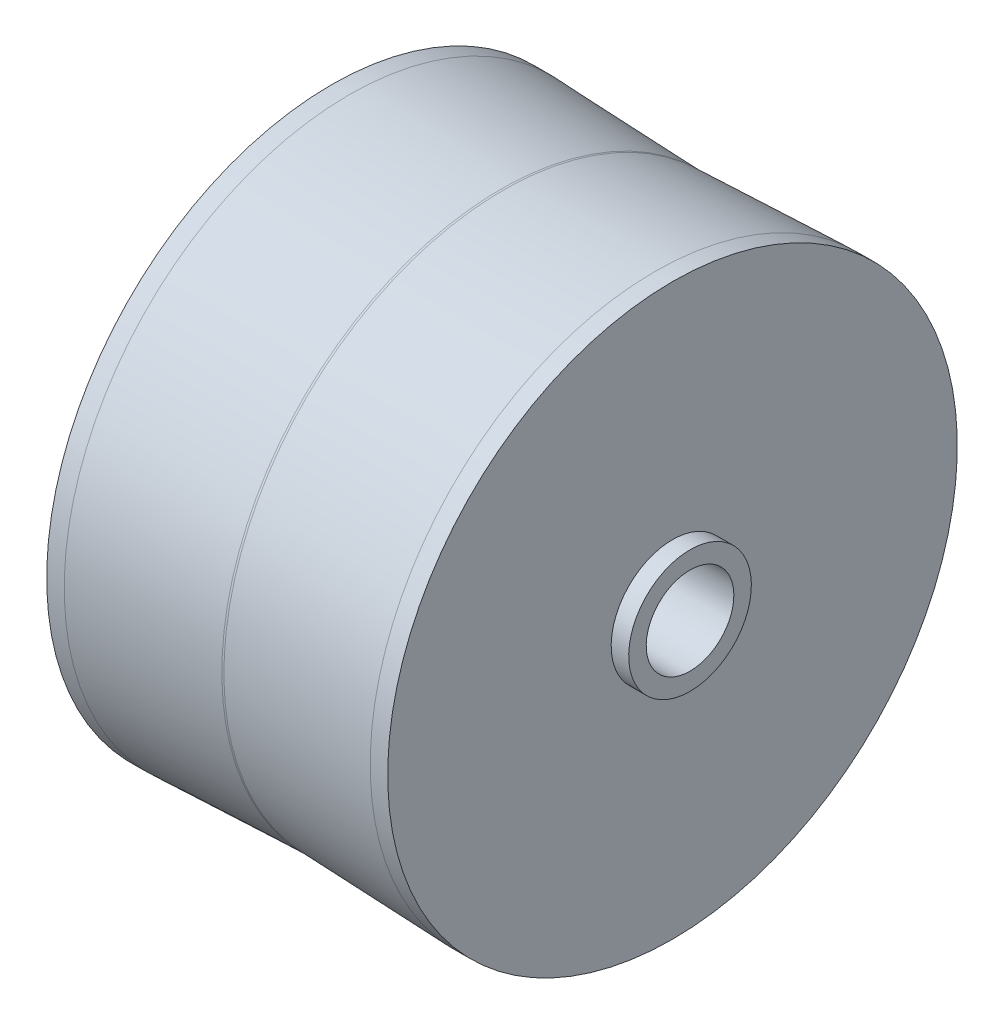
ISO-10303-21;
HEADER;
FILE_DESCRIPTION(('STEP AP214'),'2;1');
FILE_NAME('part.step','',(''),(''),'','','');
FILE_SCHEMA(('AUTOMOTIVE_DESIGN { 1 0 10303 214 1 1 1 1 }'));
ENDSEC;
DATA;
#1=APPLICATION_CONTEXT('core data for automotive mechanical design processes');
#2=APPLICATION_PROTOCOL_DEFINITION('international standard','automotive_design',2000,#1);
#3=PRODUCT_CONTEXT('',#1,'mechanical');
#4=PRODUCT('Part','Part','',(#3));
#5=PRODUCT_RELATED_PRODUCT_CATEGORY('part','',(#4));
#6=PRODUCT_DEFINITION_FORMATION('','',#4);
#7=PRODUCT_DEFINITION_CONTEXT('part definition',#1,'design');
#8=PRODUCT_DEFINITION('design','',#6,#7);
#9=PRODUCT_DEFINITION_SHAPE('','',#8);
#10=(LENGTH_UNIT() NAMED_UNIT(*) SI_UNIT(.MILLI.,.METRE.));
#11=(NAMED_UNIT(*) PLANE_ANGLE_UNIT() SI_UNIT($,.RADIAN.));
#12=(NAMED_UNIT(*) SI_UNIT($,.STERADIAN.) SOLID_ANGLE_UNIT());
#13=UNCERTAINTY_MEASURE_WITH_UNIT(LENGTH_MEASURE(1.E-05),#10,'distance_accuracy_value','');
#14=(GEOMETRIC_REPRESENTATION_CONTEXT(3) GLOBAL_UNCERTAINTY_ASSIGNED_CONTEXT((#13)) GLOBAL_UNIT_ASSIGNED_CONTEXT((#10,
#11,#12)) REPRESENTATION_CONTEXT('',''));
#15=CARTESIAN_POINT('',(0.,0.,0.));
#16=DIRECTION('',(0.,0.,1.));
#17=DIRECTION('',(1.,0.,0.));
#18=AXIS2_PLACEMENT_3D('',#15,#16,#17);
#19=CARTESIAN_POINT('',(-27.25,8.89000000000002,0.));
#20=DIRECTION('',(1.,0.,0.));
#21=DIRECTION('',(0.,1.,0.));
#22=AXIS2_PLACEMENT_3D('',#19,#20,#21);
#23=PLANE('',#22);
#24=CARTESIAN_POINT('',(-27.25,0.,0.));
#25=DIRECTION('',(-1.,0.,0.));
#26=DIRECTION('',(0.,-1.,0.));
#27=AXIS2_PLACEMENT_3D('',#24,#25,#26);
#28=CIRCLE('',#27,6.34999999999998);
#29=CARTESIAN_POINT('',(-27.25,-6.34999999999995,0.));
#30=VERTEX_POINT('',#29);
#31=EDGE_CURVE('E10',#30,#30,#28,.T.);
#32=ORIENTED_EDGE('',*,*,#31,.F.);
#33=EDGE_LOOP('',(#32));
#34=FACE_BOUND('',#33,.T.);
#35=CARTESIAN_POINT('',(-27.25,0.,0.));
#36=DIRECTION('',(-1.,0.,0.));
#37=DIRECTION('',(0.,-1.,0.));
#38=AXIS2_PLACEMENT_3D('',#35,#36,#37);
#39=CIRCLE('',#38,8.88999999999999);
#40=CARTESIAN_POINT('',(-27.25,-8.88999999999997,0.));
#41=VERTEX_POINT('',#40);
#42=EDGE_CURVE('E71',#41,#41,#39,.T.);
#43=ORIENTED_EDGE('',*,*,#42,.T.);
#44=EDGE_LOOP('',(#43));
#45=FACE_BOUND('',#44,.T.);
#46=ADVANCED_FACE('F31',(#34,#45),#23,.F.);
#47=CARTESIAN_POINT('',(-27.25,0.,0.));
#48=DIRECTION('',(-1.,0.,0.));
#49=DIRECTION('',(0.,-1.,0.));
#50=AXIS2_PLACEMENT_3D('',#47,#48,#49);
#51=CYLINDRICAL_SURFACE('',#50,6.34999999999998);
#52=CARTESIAN_POINT('',(27.25,0.,0.));
#53=DIRECTION('',(-1.,0.,0.));
#54=DIRECTION('',(0.,-1.,0.));
#55=AXIS2_PLACEMENT_3D('',#52,#53,#54);
#56=CIRCLE('',#55,6.34999999999998);
#57=CARTESIAN_POINT('',(27.25,-6.34999999999994,0.));
#58=VERTEX_POINT('',#57);
#59=EDGE_CURVE('E37',#58,#58,#56,.T.);
#60=ORIENTED_EDGE('',*,*,#59,.F.);
#61=EDGE_LOOP('',(#60));
#62=FACE_BOUND('',#61,.T.);
#63=ORIENTED_EDGE('',*,*,#31,.T.);
#64=EDGE_LOOP('',(#63));
#65=FACE_BOUND('',#64,.T.);
#66=ADVANCED_FACE('F132',(#62,#65),#51,.F.);
#67=CARTESIAN_POINT('',(27.25,6.35000000000001,0.));
#68=DIRECTION('',(-1.,0.,0.));
#69=DIRECTION('',(0.,-1.,0.));
#70=AXIS2_PLACEMENT_3D('',#67,#68,#69);
#71=PLANE('',#70);
#72=CARTESIAN_POINT('',(27.25,0.,0.));
#73=DIRECTION('',(-1.,0.,0.));
#74=DIRECTION('',(0.,-1.,0.));
#75=AXIS2_PLACEMENT_3D('',#72,#73,#74);
#76=CIRCLE('',#75,8.88999999999986);
#77=CARTESIAN_POINT('',(27.25,-8.88999999999983,0.));
#78=VERTEX_POINT('',#77);
#79=EDGE_CURVE('E41',#78,#78,#76,.T.);
#80=ORIENTED_EDGE('',*,*,#79,.F.);
#81=EDGE_LOOP('',(#80));
#82=FACE_BOUND('',#81,.T.);
#83=ORIENTED_EDGE('',*,*,#59,.T.);
#84=EDGE_LOOP('',(#83));
#85=FACE_BOUND('',#84,.T.);
#86=ADVANCED_FACE('F127',(#82,#85),#71,.F.);
#87=CARTESIAN_POINT('',(-27.25,0.,0.));
#88=DIRECTION('',(-1.,0.,0.));
#89=DIRECTION('',(0.,-1.,0.));
#90=AXIS2_PLACEMENT_3D('',#87,#88,#89);
#91=CYLINDRICAL_SURFACE('',#90,8.88999999999986);
#92=CARTESIAN_POINT('',(24.71,0.,0.));
#93=DIRECTION('',(-1.,0.,0.));
#94=DIRECTION('',(0.,-1.,0.));
#95=AXIS2_PLACEMENT_3D('',#92,#93,#94);
#96=CIRCLE('',#95,8.88999999999986);
#97=CARTESIAN_POINT('',(24.71,-8.88999999999983,0.));
#98=VERTEX_POINT('',#97);
#99=EDGE_CURVE('E45',#98,#98,#96,.T.);
#100=ORIENTED_EDGE('',*,*,#99,.F.);
#101=EDGE_LOOP('',(#100));
#102=FACE_BOUND('',#101,.T.);
#103=ORIENTED_EDGE('',*,*,#79,.T.);
#104=EDGE_LOOP('',(#103));
#105=FACE_BOUND('',#104,.T.);
#106=ADVANCED_FACE('F121',(#102,#105),#91,.T.);
#107=CARTESIAN_POINT('',(24.71,8.88999999999989,0.));
#108=DIRECTION('',(-1.,0.,0.));
#109=DIRECTION('',(0.,-1.,0.));
#110=AXIS2_PLACEMENT_3D('',#107,#108,#109);
#111=PLANE('',#110);
#112=CARTESIAN_POINT('',(24.71,0.,0.));
#113=DIRECTION('',(-1.,0.,0.));
#114=DIRECTION('',(0.,-1.,0.));
#115=AXIS2_PLACEMENT_3D('',#112,#113,#114);
#116=CIRCLE('',#115,41.275);
#117=CARTESIAN_POINT('',(24.71,-41.275,0.));
#118=VERTEX_POINT('',#117);
#119=EDGE_CURVE('E50',#118,#118,#116,.T.);
#120=ORIENTED_EDGE('',*,*,#119,.F.);
#121=EDGE_LOOP('',(#120));
#122=FACE_BOUND('',#121,.T.);
#123=ORIENTED_EDGE('',*,*,#99,.T.);
#124=EDGE_LOOP('',(#123));
#125=FACE_BOUND('',#124,.T.);
#126=ADVANCED_FACE('F115',(#122,#125),#111,.F.);
#127=CARTESIAN_POINT('',(-27.25,0.,0.));
#128=DIRECTION('',(-1.,0.,0.));
#129=DIRECTION('',(0.,-1.,0.));
#130=AXIS2_PLACEMENT_3D('',#127,#128,#129);
#131=CYLINDRICAL_SURFACE('',#130,41.275);
#132=CARTESIAN_POINT('',(22.17,0.,0.));
#133=DIRECTION('',(-1.,0.,0.));
#134=DIRECTION('',(0.,-1.,0.));
#135=AXIS2_PLACEMENT_3D('',#132,#133,#134);
#136=CIRCLE('',#135,41.275);
#137=CARTESIAN_POINT('',(22.17,-41.275,0.));
#138=VERTEX_POINT('',#137);
#139=EDGE_CURVE('E53',#138,#138,#136,.T.);
#140=ORIENTED_EDGE('',*,*,#139,.F.);
#141=EDGE_LOOP('',(#140));
#142=FACE_BOUND('',#141,.T.);
#143=ORIENTED_EDGE('',*,*,#119,.T.);
#144=EDGE_LOOP('',(#143));
#145=FACE_BOUND('',#144,.T.);
#146=ADVANCED_FACE('F109',(#142,#145),#131,.T.);
#147=CARTESIAN_POINT('',(22.17,0.,0.));
#148=DIRECTION('',(1.,0.,0.));
#149=DIRECTION('',(0.,1.,0.));
#150=AXIS2_PLACEMENT_3D('',#147,#148,#149);
#151=CONICAL_SURFACE('',#150,41.275,0.0373208364976597);
#152=CARTESIAN_POINT('',(0.14924869364771,0.,0.));
#153=DIRECTION('',(-1.,0.,0.));
#154=DIRECTION('',(0.,-1.,0.));
#155=AXIS2_PLACEMENT_3D('',#152,#153,#154);
#156=CIRCLE('',#155,40.4527853663527);
#157=CARTESIAN_POINT('',(0.149248693647715,-40.4527853663526,0.));
#158=VERTEX_POINT('',#157);
#159=EDGE_CURVE('E56',#158,#158,#156,.T.);
#160=ORIENTED_EDGE('',*,*,#159,.F.);
#161=EDGE_LOOP('',(#160));
#162=FACE_BOUND('',#161,.T.);
#163=ORIENTED_EDGE('',*,*,#139,.T.);
#164=EDGE_LOOP('',(#163));
#165=FACE_BOUND('',#164,.T.);
#166=ADVANCED_FACE('F103',(#162,#165),#151,.T.);
#167=CARTESIAN_POINT('',(0.,0.,0.));
#168=DIRECTION('',(-1.,0.,0.));
#169=DIRECTION('',(0.,-1.,0.));
#170=AXIS2_PLACEMENT_3D('',#167,#168,#169);
#171=TOROIDAL_SURFACE('',#170,44.45,3.99999999999998);
#172=CARTESIAN_POINT('',(-0.14924869364771,0.,0.));
#173=DIRECTION('',(-1.,0.,0.));
#174=DIRECTION('',(0.,-1.,0.));
#175=AXIS2_PLACEMENT_3D('',#172,#173,#174);
#176=CIRCLE('',#175,40.4527853663527);
#177=CARTESIAN_POINT('',(-0.149248693647705,-40.4527853663526,0.));
#178=VERTEX_POINT('',#177);
#179=EDGE_CURVE('E59',#178,#178,#176,.T.);
#180=ORIENTED_EDGE('',*,*,#179,.F.);
#181=EDGE_LOOP('',(#180));
#182=FACE_BOUND('',#181,.T.);
#183=ORIENTED_EDGE('',*,*,#159,.T.);
#184=EDGE_LOOP('',(#183));
#185=FACE_BOUND('',#184,.T.);
#186=ADVANCED_FACE('F97',(#182,#185),#171,.F.);
#187=CARTESIAN_POINT('',(-0.14924869364771,0.,0.));
#188=DIRECTION('',(-1.,0.,0.));
#189=DIRECTION('',(0.,-1.,0.));
#190=AXIS2_PLACEMENT_3D('',#187,#188,#189);
#191=CONICAL_SURFACE('',#190,40.4527853663527,0.0373208364976588);
#192=CARTESIAN_POINT('',(-22.17,0.,0.));
#193=DIRECTION('',(-1.,0.,0.));
#194=DIRECTION('',(0.,-1.,0.));
#195=AXIS2_PLACEMENT_3D('',#192,#193,#194);
#196=CIRCLE('',#195,41.275);
#197=CARTESIAN_POINT('',(-22.17,-41.275,0.));
#198=VERTEX_POINT('',#197);
#199=EDGE_CURVE('E62',#198,#198,#196,.T.);
#200=ORIENTED_EDGE('',*,*,#199,.F.);
#201=EDGE_LOOP('',(#200));
#202=FACE_BOUND('',#201,.T.);
#203=ORIENTED_EDGE('',*,*,#179,.T.);
#204=EDGE_LOOP('',(#203));
#205=FACE_BOUND('',#204,.T.);
#206=ADVANCED_FACE('F91',(#202,#205),#191,.T.);
#207=CARTESIAN_POINT('',(-27.25,0.,0.));
#208=DIRECTION('',(-1.,0.,0.));
#209=DIRECTION('',(0.,-1.,0.));
#210=AXIS2_PLACEMENT_3D('',#207,#208,#209);
#211=CYLINDRICAL_SURFACE('',#210,41.275);
#212=CARTESIAN_POINT('',(-24.71,0.,0.));
#213=DIRECTION('',(-1.,0.,0.));
#214=DIRECTION('',(0.,-1.,0.));
#215=AXIS2_PLACEMENT_3D('',#212,#213,#214);
#216=CIRCLE('',#215,41.275);
#217=CARTESIAN_POINT('',(-24.71,-41.275,0.));
#218=VERTEX_POINT('',#217);
#219=EDGE_CURVE('E65',#218,#218,#216,.T.);
#220=ORIENTED_EDGE('',*,*,#219,.F.);
#221=EDGE_LOOP('',(#220));
#222=FACE_BOUND('',#221,.T.);
#223=ORIENTED_EDGE('',*,*,#199,.T.);
#224=EDGE_LOOP('',(#223));
#225=FACE_BOUND('',#224,.T.);
#226=ADVANCED_FACE('F85',(#222,#225),#211,.T.);
#227=CARTESIAN_POINT('',(-24.71,41.275,0.));
#228=DIRECTION('',(1.,0.,0.));
#229=DIRECTION('',(0.,1.,0.));
#230=AXIS2_PLACEMENT_3D('',#227,#228,#229);
#231=PLANE('',#230);
#232=CARTESIAN_POINT('',(-24.71,0.,0.));
#233=DIRECTION('',(-1.,0.,0.));
#234=DIRECTION('',(0.,-1.,0.));
#235=AXIS2_PLACEMENT_3D('',#232,#233,#234);
#236=CIRCLE('',#235,8.88999999999987);
#237=CARTESIAN_POINT('',(-24.71,-8.88999999999984,0.));
#238=VERTEX_POINT('',#237);
#239=EDGE_CURVE('E68',#238,#238,#236,.T.);
#240=ORIENTED_EDGE('',*,*,#239,.F.);
#241=EDGE_LOOP('',(#240));
#242=FACE_BOUND('',#241,.T.);
#243=ORIENTED_EDGE('',*,*,#219,.T.);
#244=EDGE_LOOP('',(#243));
#245=FACE_BOUND('',#244,.T.);
#246=ADVANCED_FACE('F79',(#242,#245),#231,.F.);
#247=CARTESIAN_POINT('',(-27.25,0.,0.));
#248=DIRECTION('',(-1.,0.,0.));
#249=DIRECTION('',(0.,-1.,0.));
#250=AXIS2_PLACEMENT_3D('',#247,#248,#249);
#251=CYLINDRICAL_SURFACE('',#250,8.88999999999993);
#252=ORIENTED_EDGE('',*,*,#42,.F.);
#253=EDGE_LOOP('',(#252));
#254=FACE_BOUND('',#253,.T.);
#255=ORIENTED_EDGE('',*,*,#239,.T.);
#256=EDGE_LOOP('',(#255));
#257=FACE_BOUND('',#256,.T.);
#258=ADVANCED_FACE('F76',(#254,#257),#251,.T.);
#259=CLOSED_SHELL('',(#46,#66,#86,#106,#126,#146,#166,#186,#206,#226,#246,#258));
#260=MANIFOLD_SOLID_BREP('B2',#259);
#261=ADVANCED_BREP_SHAPE_REPRESENTATION('',(#18,#260),#14);
#262=SHAPE_DEFINITION_REPRESENTATION(#9,#261);
ENDSEC;
END-ISO-10303-21;
